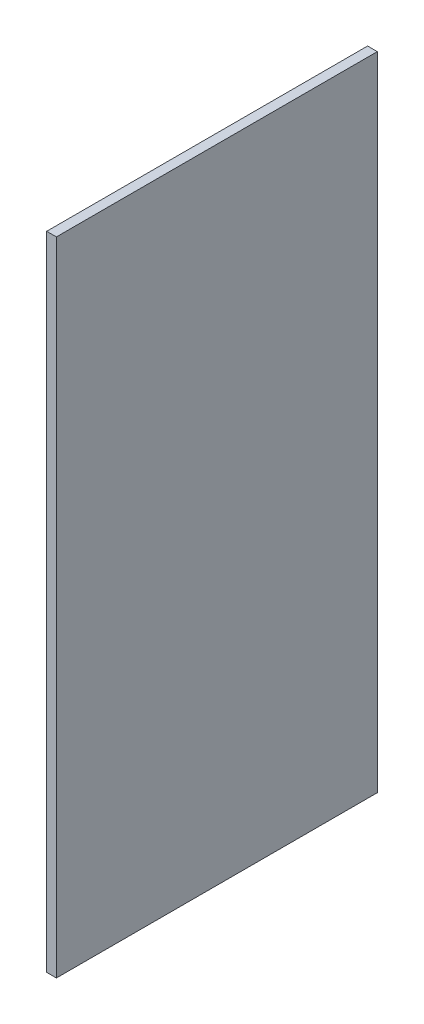
ISO-10303-21;
HEADER;
FILE_DESCRIPTION(('STEP AP214'),'2;1');
FILE_NAME('part.step','',(''),(''),'','','');
FILE_SCHEMA(('AUTOMOTIVE_DESIGN { 1 0 10303 214 1 1 1 1 }'));
ENDSEC;
DATA;
#1=APPLICATION_CONTEXT('core data for automotive mechanical design processes');
#2=APPLICATION_PROTOCOL_DEFINITION('international standard','automotive_design',2000,#1);
#3=PRODUCT_CONTEXT('',#1,'mechanical');
#4=PRODUCT('Part','Part','',(#3));
#5=PRODUCT_RELATED_PRODUCT_CATEGORY('part','',(#4));
#6=PRODUCT_DEFINITION_FORMATION('','',#4);
#7=PRODUCT_DEFINITION_CONTEXT('part definition',#1,'design');
#8=PRODUCT_DEFINITION('design','',#6,#7);
#9=PRODUCT_DEFINITION_SHAPE('','',#8);
#10=(LENGTH_UNIT() NAMED_UNIT(*) SI_UNIT(.MILLI.,.METRE.));
#11=(NAMED_UNIT(*) PLANE_ANGLE_UNIT() SI_UNIT($,.RADIAN.));
#12=(NAMED_UNIT(*) SI_UNIT($,.STERADIAN.) SOLID_ANGLE_UNIT());
#13=UNCERTAINTY_MEASURE_WITH_UNIT(LENGTH_MEASURE(1.E-05),#10,'distance_accuracy_value','');
#14=(GEOMETRIC_REPRESENTATION_CONTEXT(3) GLOBAL_UNCERTAINTY_ASSIGNED_CONTEXT((#13)) GLOBAL_UNIT_ASSIGNED_CONTEXT((#10,
#11,#12)) REPRESENTATION_CONTEXT('',''));
#15=CARTESIAN_POINT('',(0.,0.,0.));
#16=DIRECTION('',(0.,0.,1.));
#17=DIRECTION('',(1.,0.,0.));
#18=AXIS2_PLACEMENT_3D('',#15,#16,#17);
#19=CARTESIAN_POINT('',(5.,0.,0.));
#20=DIRECTION('',(0.,0.,-1.));
#21=DIRECTION('',(-1.,0.,0.));
#22=AXIS2_PLACEMENT_3D('',#19,#20,#21);
#23=PLANE('',#22);
#24=DIRECTION('',(0.,-1.,0.));
#25=VECTOR('',#24,1.);
#26=CARTESIAN_POINT('',(0.,0.,0.));
#27=LINE('',#26,#25);
#28=CARTESIAN_POINT('',(0.,330.,0.));
#29=VERTEX_POINT('',#28);
#30=CARTESIAN_POINT('',(0.,0.,0.));
#31=VERTEX_POINT('',#30);
#32=EDGE_CURVE('E98',#29,#31,#27,.T.);
#33=ORIENTED_EDGE('',*,*,#32,.T.);
#34=DIRECTION('',(-1.,0.,0.));
#35=VECTOR('',#34,1.);
#36=CARTESIAN_POINT('',(5.,0.,0.));
#37=LINE('',#36,#35);
#38=CARTESIAN_POINT('',(5.,0.,0.));
#39=VERTEX_POINT('',#38);
#40=EDGE_CURVE('E11',#39,#31,#37,.T.);
#41=ORIENTED_EDGE('',*,*,#40,.F.);
#42=DIRECTION('',(0.,-1.,0.));
#43=VECTOR('',#42,1.);
#44=CARTESIAN_POINT('',(5.,0.,0.));
#45=LINE('',#44,#43);
#46=CARTESIAN_POINT('',(5.,330.,0.));
#47=VERTEX_POINT('',#46);
#48=EDGE_CURVE('E86',#47,#39,#45,.T.);
#49=ORIENTED_EDGE('',*,*,#48,.F.);
#50=DIRECTION('',(-1.,0.,0.));
#51=VECTOR('',#50,1.);
#52=CARTESIAN_POINT('',(5.,330.,0.));
#53=LINE('',#52,#51);
#54=EDGE_CURVE('E94',#47,#29,#53,.T.);
#55=ORIENTED_EDGE('',*,*,#54,.T.);
#56=EDGE_LOOP('',(#33,#41,#49,#55));
#57=FACE_BOUND('',#56,.T.);
#58=ADVANCED_FACE('F35',(#57),#23,.F.);
#59=CARTESIAN_POINT('',(5.,0.,0.));
#60=DIRECTION('',(0.,1.,0.));
#61=DIRECTION('',(0.,0.,1.));
#62=AXIS2_PLACEMENT_3D('',#59,#60,#61);
#63=PLANE('',#62);
#64=DIRECTION('',(0.,0.,-1.));
#65=VECTOR('',#64,1.);
#66=CARTESIAN_POINT('',(0.,0.,0.));
#67=LINE('',#66,#65);
#68=CARTESIAN_POINT('',(0.,0.,-165.));
#69=VERTEX_POINT('',#68);
#70=EDGE_CURVE('E90',#31,#69,#67,.T.);
#71=ORIENTED_EDGE('',*,*,#70,.T.);
#72=DIRECTION('',(-1.,0.,0.));
#73=VECTOR('',#72,1.);
#74=CARTESIAN_POINT('',(5.,0.,-165.));
#75=LINE('',#74,#73);
#76=CARTESIAN_POINT('',(5.,0.,-165.));
#77=VERTEX_POINT('',#76);
#78=EDGE_CURVE('E43',#77,#69,#75,.T.);
#79=ORIENTED_EDGE('',*,*,#78,.F.);
#80=DIRECTION('',(0.,0.,-1.));
#81=VECTOR('',#80,1.);
#82=CARTESIAN_POINT('',(5.,0.,0.));
#83=LINE('',#82,#81);
#84=EDGE_CURVE('E81',#39,#77,#83,.T.);
#85=ORIENTED_EDGE('',*,*,#84,.F.);
#86=ORIENTED_EDGE('',*,*,#40,.T.);
#87=EDGE_LOOP('',(#71,#79,#85,#86));
#88=FACE_BOUND('',#87,.T.);
#89=ADVANCED_FACE('F89',(#88),#63,.F.);
#90=CARTESIAN_POINT('',(5.,0.,-165.));
#91=DIRECTION('',(0.,0.,1.));
#92=DIRECTION('',(1.,0.,0.));
#93=AXIS2_PLACEMENT_3D('',#90,#91,#92);
#94=PLANE('',#93);
#95=DIRECTION('',(0.,1.,0.));
#96=VECTOR('',#95,1.);
#97=CARTESIAN_POINT('',(0.,0.,-165.));
#98=LINE('',#97,#96);
#99=CARTESIAN_POINT('',(0.,330.,-165.));
#100=VERTEX_POINT('',#99);
#101=EDGE_CURVE('E68',#69,#100,#98,.T.);
#102=ORIENTED_EDGE('',*,*,#101,.T.);
#103=DIRECTION('',(-1.,0.,0.));
#104=VECTOR('',#103,1.);
#105=CARTESIAN_POINT('',(5.,330.,-165.));
#106=LINE('',#105,#104);
#107=CARTESIAN_POINT('',(5.,330.,-165.));
#108=VERTEX_POINT('',#107);
#109=EDGE_CURVE('E91',#108,#100,#106,.T.);
#110=ORIENTED_EDGE('',*,*,#109,.F.);
#111=DIRECTION('',(0.,1.,0.));
#112=VECTOR('',#111,1.);
#113=CARTESIAN_POINT('',(5.,0.,-165.));
#114=LINE('',#113,#112);
#115=EDGE_CURVE('E84',#77,#108,#114,.T.);
#116=ORIENTED_EDGE('',*,*,#115,.F.);
#117=ORIENTED_EDGE('',*,*,#78,.T.);
#118=EDGE_LOOP('',(#102,#110,#116,#117));
#119=FACE_BOUND('',#118,.T.);
#120=ADVANCED_FACE('F92',(#119),#94,.F.);
#121=CARTESIAN_POINT('',(5.,330.,0.));
#122=DIRECTION('',(0.,-1.,0.));
#123=DIRECTION('',(0.,0.,-1.));
#124=AXIS2_PLACEMENT_3D('',#121,#122,#123);
#125=PLANE('',#124);
#126=DIRECTION('',(0.,0.,1.));
#127=VECTOR('',#126,1.);
#128=CARTESIAN_POINT('',(0.,330.,0.));
#129=LINE('',#128,#127);
#130=EDGE_CURVE('E74',#100,#29,#129,.T.);
#131=ORIENTED_EDGE('',*,*,#130,.T.);
#132=ORIENTED_EDGE('',*,*,#54,.F.);
#133=DIRECTION('',(0.,0.,1.));
#134=VECTOR('',#133,1.);
#135=CARTESIAN_POINT('',(5.,330.,0.));
#136=LINE('',#135,#134);
#137=EDGE_CURVE('E51',#108,#47,#136,.T.);
#138=ORIENTED_EDGE('',*,*,#137,.F.);
#139=ORIENTED_EDGE('',*,*,#109,.T.);
#140=EDGE_LOOP('',(#131,#132,#138,#139));
#141=FACE_BOUND('',#140,.T.);
#142=ADVANCED_FACE('F105',(#141),#125,.F.);
#143=CARTESIAN_POINT('',(5.,0.,0.));
#144=DIRECTION('',(-1.,0.,0.));
#145=DIRECTION('',(0.,0.,1.));
#146=AXIS2_PLACEMENT_3D('',#143,#144,#145);
#147=PLANE('',#146);
#148=ORIENTED_EDGE('',*,*,#48,.T.);
#149=ORIENTED_EDGE('',*,*,#84,.T.);
#150=ORIENTED_EDGE('',*,*,#115,.T.);
#151=ORIENTED_EDGE('',*,*,#137,.T.);
#152=EDGE_LOOP('',(#148,#149,#150,#151));
#153=FACE_BOUND('',#152,.T.);
#154=ADVANCED_FACE('F82',(#153),#147,.F.);
#155=CARTESIAN_POINT('',(0.,0.,0.));
#156=DIRECTION('',(-1.,0.,0.));
#157=DIRECTION('',(0.,0.,1.));
#158=AXIS2_PLACEMENT_3D('',#155,#156,#157);
#159=PLANE('',#158);
#160=ORIENTED_EDGE('',*,*,#32,.F.);
#161=ORIENTED_EDGE('',*,*,#130,.F.);
#162=ORIENTED_EDGE('',*,*,#101,.F.);
#163=ORIENTED_EDGE('',*,*,#70,.F.);
#164=EDGE_LOOP('',(#160,#161,#162,#163));
#165=FACE_BOUND('',#164,.T.);
#166=ADVANCED_FACE('F108',(#165),#159,.T.);
#167=CLOSED_SHELL('',(#58,#89,#120,#142,#154,#166));
#168=MANIFOLD_SOLID_BREP('B2',#167);
#169=ADVANCED_BREP_SHAPE_REPRESENTATION('',(#18,#168),#14);
#170=SHAPE_DEFINITION_REPRESENTATION(#9,#169);
ENDSEC;
END-ISO-10303-21;
